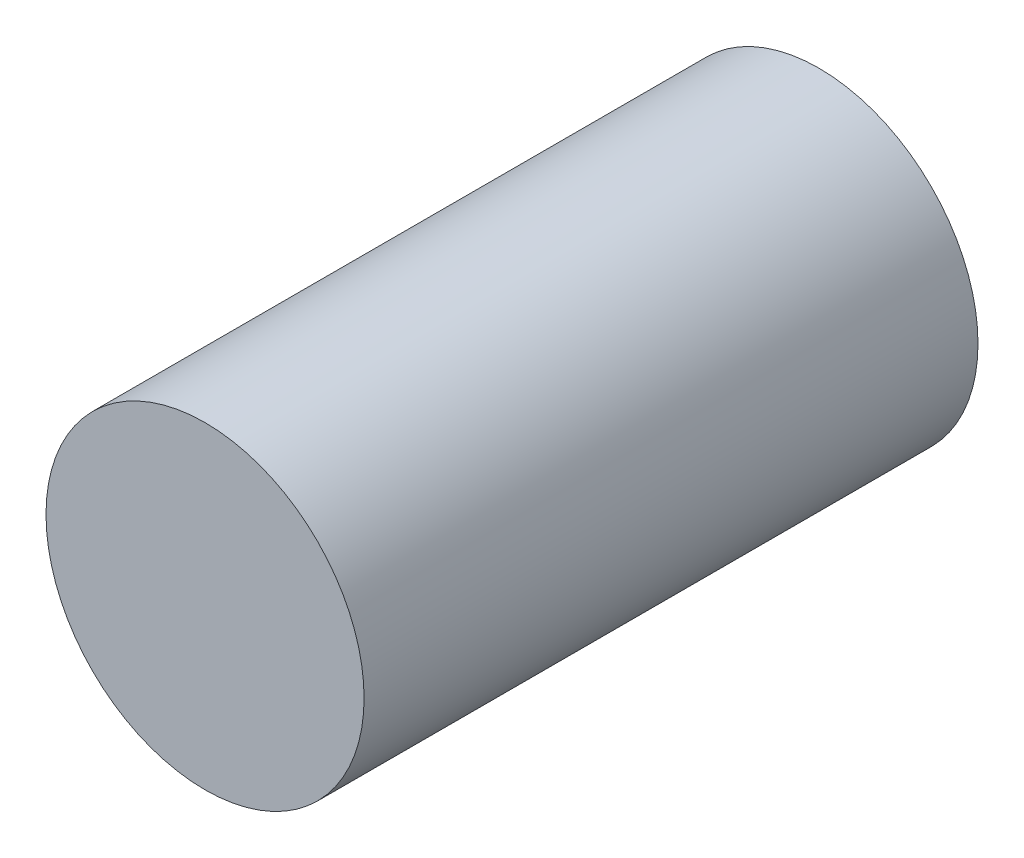
ISO-10303-21;
HEADER;
FILE_DESCRIPTION(('STEP AP214'),'2;1');
FILE_NAME('part.step','',(''),(''),'','','');
FILE_SCHEMA(('AUTOMOTIVE_DESIGN { 1 0 10303 214 1 1 1 1 }'));
ENDSEC;
DATA;
#1=APPLICATION_CONTEXT('core data for automotive mechanical design processes');
#2=APPLICATION_PROTOCOL_DEFINITION('international standard','automotive_design',2000,#1);
#3=PRODUCT_CONTEXT('',#1,'mechanical');
#4=PRODUCT('Part','Part','',(#3));
#5=PRODUCT_RELATED_PRODUCT_CATEGORY('part','',(#4));
#6=PRODUCT_DEFINITION_FORMATION('','',#4);
#7=PRODUCT_DEFINITION_CONTEXT('part definition',#1,'design');
#8=PRODUCT_DEFINITION('design','',#6,#7);
#9=PRODUCT_DEFINITION_SHAPE('','',#8);
#10=(LENGTH_UNIT() NAMED_UNIT(*) SI_UNIT(.MILLI.,.METRE.));
#11=(NAMED_UNIT(*) PLANE_ANGLE_UNIT() SI_UNIT($,.RADIAN.));
#12=(NAMED_UNIT(*) SI_UNIT($,.STERADIAN.) SOLID_ANGLE_UNIT());
#13=UNCERTAINTY_MEASURE_WITH_UNIT(LENGTH_MEASURE(1.E-05),#10,'distance_accuracy_value','');
#14=(GEOMETRIC_REPRESENTATION_CONTEXT(3) GLOBAL_UNCERTAINTY_ASSIGNED_CONTEXT((#13)) GLOBAL_UNIT_ASSIGNED_CONTEXT((#10,
#11,#12)) REPRESENTATION_CONTEXT('',''));
#15=CARTESIAN_POINT('',(0.,0.,0.));
#16=DIRECTION('',(0.,0.,1.));
#17=DIRECTION('',(1.,0.,0.));
#18=AXIS2_PLACEMENT_3D('',#15,#16,#17);
#19=CARTESIAN_POINT('',(0.,0.,1.93));
#20=DIRECTION('',(0.,0.,-1.));
#21=DIRECTION('',(-1.,0.,0.));
#22=AXIS2_PLACEMENT_3D('',#19,#20,#21);
#23=CYLINDRICAL_SURFACE('',#22,1.);
#24=CARTESIAN_POINT('',(0.,0.,1.93));
#25=DIRECTION('',(0.,0.,1.));
#26=DIRECTION('',(1.,0.,0.));
#27=AXIS2_PLACEMENT_3D('',#24,#25,#26);
#28=CIRCLE('',#27,1.);
#29=CARTESIAN_POINT('',(1.,0.,1.93));
#30=VERTEX_POINT('',#29);
#31=EDGE_CURVE('E10',#30,#30,#28,.T.);
#32=ORIENTED_EDGE('',*,*,#31,.F.);
#33=EDGE_LOOP('',(#32));
#34=FACE_BOUND('',#33,.T.);
#35=CARTESIAN_POINT('',(0.,0.,-1.93));
#36=DIRECTION('',(0.,0.,1.));
#37=DIRECTION('',(1.,0.,0.));
#38=AXIS2_PLACEMENT_3D('',#35,#36,#37);
#39=CIRCLE('',#38,1.);
#40=CARTESIAN_POINT('',(1.,0.,-1.93));
#41=VERTEX_POINT('',#40);
#42=EDGE_CURVE('E40',#41,#41,#39,.T.);
#43=ORIENTED_EDGE('',*,*,#42,.T.);
#44=EDGE_LOOP('',(#43));
#45=FACE_BOUND('',#44,.T.);
#46=ADVANCED_FACE('F37',(#34,#45),#23,.T.);
#47=CARTESIAN_POINT('',(0.,0.,1.93));
#48=DIRECTION('',(0.,0.,1.));
#49=DIRECTION('',(1.,0.,0.));
#50=AXIS2_PLACEMENT_3D('',#47,#48,#49);
#51=PLANE('',#50);
#52=ORIENTED_EDGE('',*,*,#31,.T.);
#53=EDGE_LOOP('',(#52));
#54=FACE_BOUND('',#53,.T.);
#55=ADVANCED_FACE('F54',(#54),#51,.T.);
#56=CARTESIAN_POINT('',(0.,0.,-1.93));
#57=DIRECTION('',(0.,0.,1.));
#58=DIRECTION('',(1.,0.,0.));
#59=AXIS2_PLACEMENT_3D('',#56,#57,#58);
#60=PLANE('',#59);
#61=ORIENTED_EDGE('',*,*,#42,.F.);
#62=EDGE_LOOP('',(#61));
#63=FACE_BOUND('',#62,.T.);
#64=ADVANCED_FACE('F52',(#63),#60,.F.);
#65=CLOSED_SHELL('',(#46,#55,#64));
#66=MANIFOLD_SOLID_BREP('B2',#65);
#67=ADVANCED_BREP_SHAPE_REPRESENTATION('',(#18,#66),#14);
#68=SHAPE_DEFINITION_REPRESENTATION(#9,#67);
ENDSEC;
END-ISO-10303-21;
